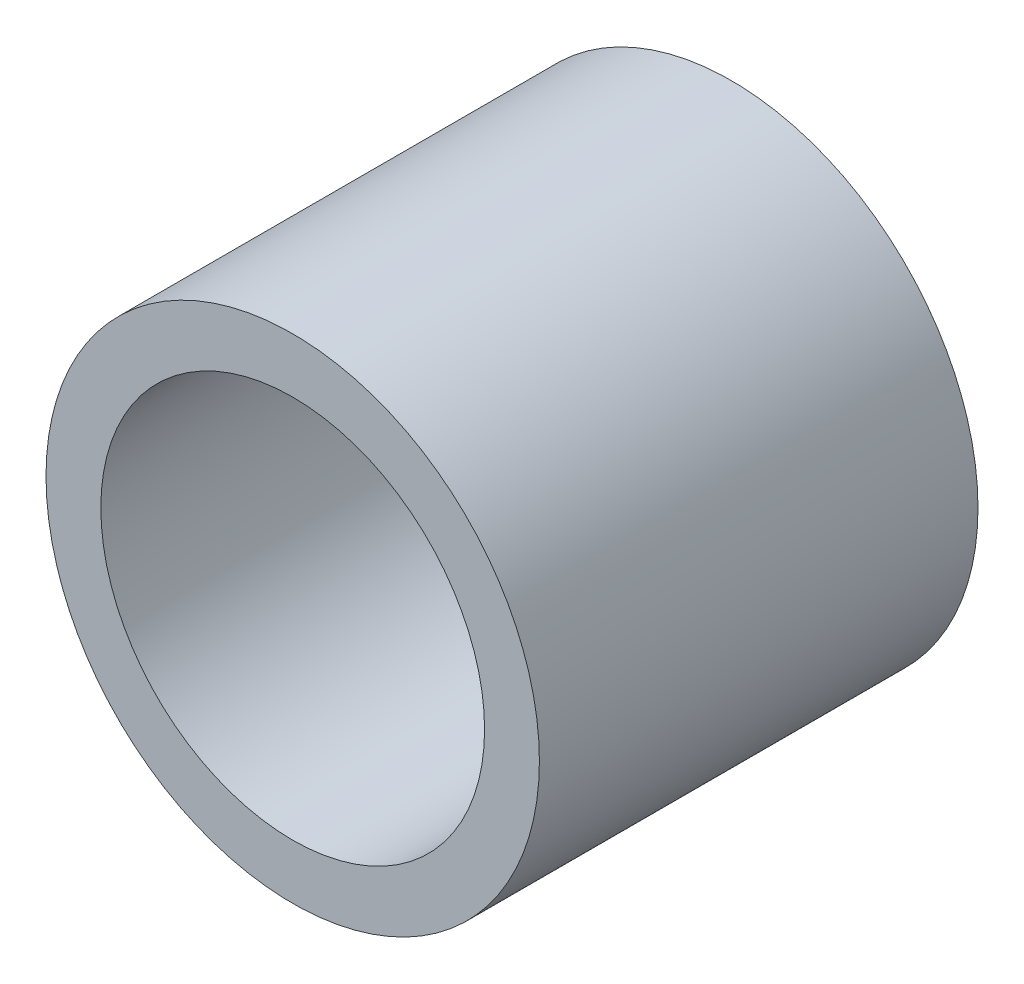
ISO-10303-21;
HEADER;
FILE_DESCRIPTION(('STEP AP214'),'2;1');
FILE_NAME('part.step','',(''),(''),'','','');
FILE_SCHEMA(('AUTOMOTIVE_DESIGN { 1 0 10303 214 1 1 1 1 }'));
ENDSEC;
DATA;
#1=APPLICATION_CONTEXT('core data for automotive mechanical design processes');
#2=APPLICATION_PROTOCOL_DEFINITION('international standard','automotive_design',2000,#1);
#3=PRODUCT_CONTEXT('',#1,'mechanical');
#4=PRODUCT('Part','Part','',(#3));
#5=PRODUCT_RELATED_PRODUCT_CATEGORY('part','',(#4));
#6=PRODUCT_DEFINITION_FORMATION('','',#4);
#7=PRODUCT_DEFINITION_CONTEXT('part definition',#1,'design');
#8=PRODUCT_DEFINITION('design','',#6,#7);
#9=PRODUCT_DEFINITION_SHAPE('','',#8);
#10=(LENGTH_UNIT() NAMED_UNIT(*) SI_UNIT(.MILLI.,.METRE.));
#11=(NAMED_UNIT(*) PLANE_ANGLE_UNIT() SI_UNIT($,.RADIAN.));
#12=(NAMED_UNIT(*) SI_UNIT($,.STERADIAN.) SOLID_ANGLE_UNIT());
#13=UNCERTAINTY_MEASURE_WITH_UNIT(LENGTH_MEASURE(1.E-05),#10,'distance_accuracy_value','');
#14=(GEOMETRIC_REPRESENTATION_CONTEXT(3) GLOBAL_UNCERTAINTY_ASSIGNED_CONTEXT((#13)) GLOBAL_UNIT_ASSIGNED_CONTEXT((#10,
#11,#12)) REPRESENTATION_CONTEXT('',''));
#15=CARTESIAN_POINT('',(0.,0.,0.));
#16=DIRECTION('',(0.,0.,1.));
#17=DIRECTION('',(1.,0.,0.));
#18=AXIS2_PLACEMENT_3D('',#15,#16,#17);
#19=CARTESIAN_POINT('',(0.,0.,8.));
#20=DIRECTION('',(0.,0.,1.));
#21=DIRECTION('',(1.,0.,0.));
#22=AXIS2_PLACEMENT_3D('',#19,#20,#21);
#23=PLANE('',#22);
#24=CARTESIAN_POINT('',(0.,0.,8.));
#25=DIRECTION('',(0.,0.,1.));
#26=DIRECTION('',(1.,0.,0.));
#27=AXIS2_PLACEMENT_3D('',#24,#25,#26);
#28=CIRCLE('',#27,4.5);
#29=CARTESIAN_POINT('',(4.5,0.,8.));
#30=VERTEX_POINT('',#29);
#31=EDGE_CURVE('E10',#30,#30,#28,.T.);
#32=ORIENTED_EDGE('',*,*,#31,.T.);
#33=EDGE_LOOP('',(#32));
#34=FACE_BOUND('',#33,.T.);
#35=CARTESIAN_POINT('',(0.,0.,8.));
#36=DIRECTION('',(0.,0.,1.));
#37=DIRECTION('',(1.,0.,0.));
#38=AXIS2_PLACEMENT_3D('',#35,#36,#37);
#39=CIRCLE('',#38,3.5);
#40=CARTESIAN_POINT('',(3.5,0.,8.));
#41=VERTEX_POINT('',#40);
#42=EDGE_CURVE('E42',#41,#41,#39,.T.);
#43=ORIENTED_EDGE('',*,*,#42,.F.);
#44=EDGE_LOOP('',(#43));
#45=FACE_BOUND('',#44,.T.);
#46=ADVANCED_FACE('F31',(#34,#45),#23,.T.);
#47=CARTESIAN_POINT('',(0.,0.,0.));
#48=DIRECTION('',(0.,0.,1.));
#49=DIRECTION('',(1.,0.,0.));
#50=AXIS2_PLACEMENT_3D('',#47,#48,#49);
#51=PLANE('',#50);
#52=CARTESIAN_POINT('',(0.,0.,0.));
#53=DIRECTION('',(0.,0.,1.));
#54=DIRECTION('',(1.,0.,0.));
#55=AXIS2_PLACEMENT_3D('',#52,#53,#54);
#56=CIRCLE('',#55,4.5);
#57=CARTESIAN_POINT('',(4.5,0.,0.));
#58=VERTEX_POINT('',#57);
#59=EDGE_CURVE('E38',#58,#58,#56,.T.);
#60=ORIENTED_EDGE('',*,*,#59,.F.);
#61=EDGE_LOOP('',(#60));
#62=FACE_BOUND('',#61,.T.);
#63=CARTESIAN_POINT('',(0.,0.,0.));
#64=DIRECTION('',(0.,0.,1.));
#65=DIRECTION('',(1.,0.,0.));
#66=AXIS2_PLACEMENT_3D('',#63,#64,#65);
#67=CIRCLE('',#66,3.5);
#68=CARTESIAN_POINT('',(3.5,0.,0.));
#69=VERTEX_POINT('',#68);
#70=EDGE_CURVE('E46',#69,#69,#67,.T.);
#71=ORIENTED_EDGE('',*,*,#70,.T.);
#72=EDGE_LOOP('',(#71));
#73=FACE_BOUND('',#72,.T.);
#74=ADVANCED_FACE('F52',(#62,#73),#51,.F.);
#75=CARTESIAN_POINT('',(0.,0.,8.));
#76=DIRECTION('',(0.,0.,-1.));
#77=DIRECTION('',(-1.,0.,0.));
#78=AXIS2_PLACEMENT_3D('',#75,#76,#77);
#79=CYLINDRICAL_SURFACE('',#78,4.5);
#80=ORIENTED_EDGE('',*,*,#31,.F.);
#81=EDGE_LOOP('',(#80));
#82=FACE_BOUND('',#81,.T.);
#83=ORIENTED_EDGE('',*,*,#59,.T.);
#84=EDGE_LOOP('',(#83));
#85=FACE_BOUND('',#84,.T.);
#86=ADVANCED_FACE('F33',(#82,#85),#79,.T.);
#87=CARTESIAN_POINT('',(0.,0.,8.));
#88=DIRECTION('',(0.,0.,-1.));
#89=DIRECTION('',(-1.,0.,0.));
#90=AXIS2_PLACEMENT_3D('',#87,#88,#89);
#91=CYLINDRICAL_SURFACE('',#90,3.5);
#92=ORIENTED_EDGE('',*,*,#42,.T.);
#93=EDGE_LOOP('',(#92));
#94=FACE_BOUND('',#93,.T.);
#95=ORIENTED_EDGE('',*,*,#70,.F.);
#96=EDGE_LOOP('',(#95));
#97=FACE_BOUND('',#96,.T.);
#98=ADVANCED_FACE('F54',(#94,#97),#91,.F.);
#99=CLOSED_SHELL('',(#46,#74,#86,#98));
#100=MANIFOLD_SOLID_BREP('B2',#99);
#101=ADVANCED_BREP_SHAPE_REPRESENTATION('',(#18,#100),#14);
#102=SHAPE_DEFINITION_REPRESENTATION(#9,#101);
ENDSEC;
END-ISO-10303-21;
